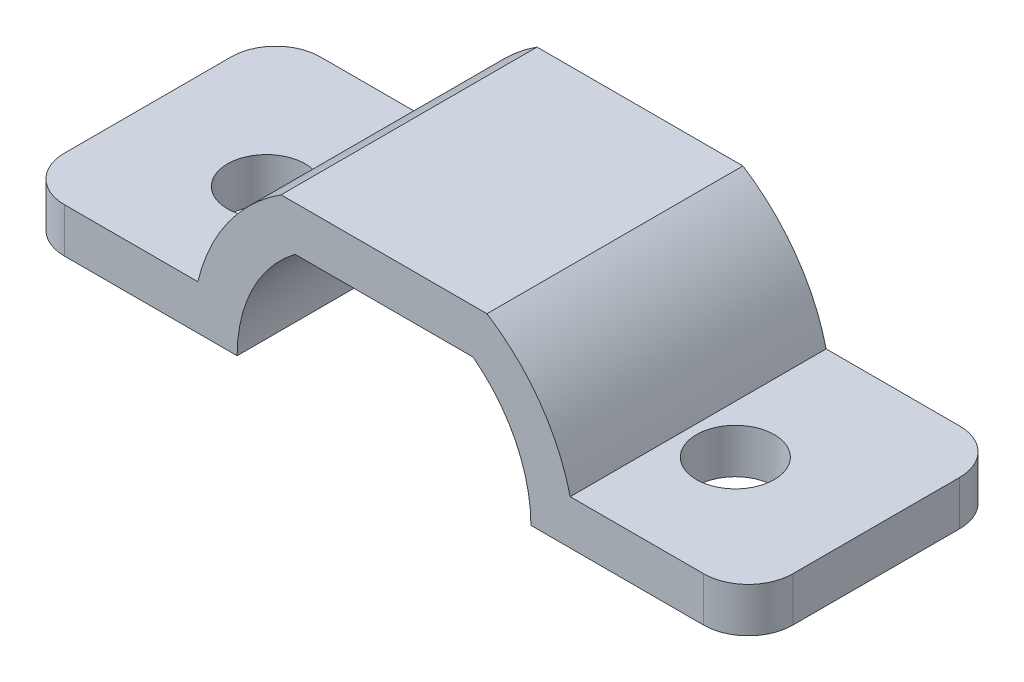
ISO-10303-21;
HEADER;
FILE_DESCRIPTION(('STEP AP214'),'2;1');
FILE_NAME('part.step','',(''),(''),'','','');
FILE_SCHEMA(('AUTOMOTIVE_DESIGN { 1 0 10303 214 1 1 1 1 }'));
ENDSEC;
DATA;
#1=APPLICATION_CONTEXT('core data for automotive mechanical design processes');
#2=APPLICATION_PROTOCOL_DEFINITION('international standard','automotive_design',2000,#1);
#3=PRODUCT_CONTEXT('',#1,'mechanical');
#4=PRODUCT('Part','Part','',(#3));
#5=PRODUCT_RELATED_PRODUCT_CATEGORY('part','',(#4));
#6=PRODUCT_DEFINITION_FORMATION('','',#4);
#7=PRODUCT_DEFINITION_CONTEXT('part definition',#1,'design');
#8=PRODUCT_DEFINITION('design','',#6,#7);
#9=PRODUCT_DEFINITION_SHAPE('','',#8);
#10=(LENGTH_UNIT() NAMED_UNIT(*) SI_UNIT(.MILLI.,.METRE.));
#11=(NAMED_UNIT(*) PLANE_ANGLE_UNIT() SI_UNIT($,.RADIAN.));
#12=(NAMED_UNIT(*) SI_UNIT($,.STERADIAN.) SOLID_ANGLE_UNIT());
#13=UNCERTAINTY_MEASURE_WITH_UNIT(LENGTH_MEASURE(1.E-05),#10,'distance_accuracy_value','');
#14=(GEOMETRIC_REPRESENTATION_CONTEXT(3) GLOBAL_UNCERTAINTY_ASSIGNED_CONTEXT((#13)) GLOBAL_UNIT_ASSIGNED_CONTEXT((#10,
#11,#12)) REPRESENTATION_CONTEXT('',''));
#15=CARTESIAN_POINT('',(0.,0.,0.));
#16=DIRECTION('',(0.,0.,1.));
#17=DIRECTION('',(1.,0.,0.));
#18=AXIS2_PLACEMENT_3D('',#15,#16,#17);
#19=CARTESIAN_POINT('',(0.,0.,5.75));
#20=DIRECTION('',(0.,0.,-1.));
#21=DIRECTION('',(-1.,0.,0.));
#22=AXIS2_PLACEMENT_3D('',#19,#20,#21);
#23=CYLINDRICAL_SURFACE('',#22,8.6);
#24=DIRECTION('',(0.,0.,-1.));
#25=VECTOR('',#24,1.);
#26=CARTESIAN_POINT('',(-8.36420946653059,2.,5.75));
#27=LINE('',#26,#25);
#28=CARTESIAN_POINT('',(-8.36420946653059,2.,5.75));
#29=VERTEX_POINT('',#28);
#30=CARTESIAN_POINT('',(-8.36420946653059,2.,-5.75));
#31=VERTEX_POINT('',#30);
#32=EDGE_CURVE('E152',#29,#31,#27,.T.);
#33=ORIENTED_EDGE('',*,*,#32,.F.);
#34=CARTESIAN_POINT('',(0.,0.,5.75));
#35=DIRECTION('',(0.,0.,1.));
#36=DIRECTION('',(1.,0.,0.));
#37=AXIS2_PLACEMENT_3D('',#34,#35,#36);
#38=CIRCLE('',#37,8.6);
#39=CARTESIAN_POINT('',(-4.62574318353278,7.25,5.75));
#40=VERTEX_POINT('',#39);
#41=EDGE_CURVE('E164',#40,#29,#38,.T.);
#42=ORIENTED_EDGE('',*,*,#41,.F.);
#43=DIRECTION('',(0.,0.,-1.));
#44=VECTOR('',#43,1.);
#45=CARTESIAN_POINT('',(-4.62574318353278,7.25,5.75));
#46=LINE('',#45,#44);
#47=CARTESIAN_POINT('',(-4.62574318353278,7.25,-5.75));
#48=VERTEX_POINT('',#47);
#49=EDGE_CURVE('E216',#40,#48,#46,.T.);
#50=ORIENTED_EDGE('',*,*,#49,.T.);
#51=CARTESIAN_POINT('',(0.,0.,-5.75));
#52=DIRECTION('',(0.,0.,1.));
#53=DIRECTION('',(1.,0.,0.));
#54=AXIS2_PLACEMENT_3D('',#51,#52,#53);
#55=CIRCLE('',#54,8.6);
#56=EDGE_CURVE('E167',#48,#31,#55,.T.);
#57=ORIENTED_EDGE('',*,*,#56,.T.);
#58=EDGE_LOOP('',(#33,#42,#50,#57));
#59=FACE_BOUND('',#58,.T.);
#60=ADVANCED_FACE('F35',(#59),#23,.T.);
#61=CARTESIAN_POINT('',(0.,0.,5.75));
#62=DIRECTION('',(0.,1.,0.));
#63=DIRECTION('',(0.,0.,1.));
#64=AXIS2_PLACEMENT_3D('',#61,#62,#63);
#65=PLANE('',#64);
#66=CARTESIAN_POINT('',(10.535,0.,0.5));
#67=DIRECTION('',(0.,-1.,0.));
#68=DIRECTION('',(0.,0.,1.));
#69=AXIS2_PLACEMENT_3D('',#66,#67,#68);
#70=CIRCLE('',#69,1.75);
#71=CARTESIAN_POINT('',(10.535,0.,2.25));
#72=VERTEX_POINT('',#71);
#73=EDGE_CURVE('E517',#72,#72,#70,.T.);
#74=ORIENTED_EDGE('',*,*,#73,.F.);
#75=EDGE_LOOP('',(#74));
#76=FACE_BOUND('',#75,.T.);
#77=DIRECTION('',(1.,0.,0.));
#78=VECTOR('',#77,1.);
#79=CARTESIAN_POINT('',(0.,0.,-5.75));
#80=LINE('',#79,#78);
#81=CARTESIAN_POINT('',(6.6,0.,-5.75));
#82=VERTEX_POINT('',#81);
#83=CARTESIAN_POINT('',(14.3642094665306,0.,-5.75));
#84=VERTEX_POINT('',#83);
#85=EDGE_CURVE('E221',#82,#84,#80,.T.);
#86=ORIENTED_EDGE('',*,*,#85,.T.);
#87=CARTESIAN_POINT('',(14.3642094665306,0.,-3.75));
#88=DIRECTION('',(0.,1.,0.));
#89=DIRECTION('',(0.,0.,1.));
#90=AXIS2_PLACEMENT_3D('',#87,#88,#89);
#91=CIRCLE('',#90,2.);
#92=CARTESIAN_POINT('',(16.3642094665306,0.,-3.75));
#93=VERTEX_POINT('',#92);
#94=EDGE_CURVE('E11',#84,#93,#91,.F.);
#95=ORIENTED_EDGE('',*,*,#94,.T.);
#96=DIRECTION('',(0.,0.,-1.));
#97=VECTOR('',#96,1.);
#98=CARTESIAN_POINT('',(16.3642094665306,0.,5.75));
#99=LINE('',#98,#97);
#100=CARTESIAN_POINT('',(16.3642094665306,0.,3.75));
#101=VERTEX_POINT('',#100);
#102=EDGE_CURVE('E238',#101,#93,#99,.T.);
#103=ORIENTED_EDGE('',*,*,#102,.F.);
#104=CARTESIAN_POINT('',(14.3642094665306,0.,3.75));
#105=DIRECTION('',(0.,1.,0.));
#106=DIRECTION('',(0.,0.,1.));
#107=AXIS2_PLACEMENT_3D('',#104,#105,#106);
#108=CIRCLE('',#107,2.);
#109=CARTESIAN_POINT('',(14.3642094665306,0.,5.75));
#110=VERTEX_POINT('',#109);
#111=EDGE_CURVE('E43',#101,#110,#108,.F.);
#112=ORIENTED_EDGE('',*,*,#111,.T.);
#113=DIRECTION('',(1.,0.,0.));
#114=VECTOR('',#113,1.);
#115=CARTESIAN_POINT('',(0.,0.,5.75));
#116=LINE('',#115,#114);
#117=CARTESIAN_POINT('',(6.6,0.,5.75));
#118=VERTEX_POINT('',#117);
#119=EDGE_CURVE('E222',#118,#110,#116,.T.);
#120=ORIENTED_EDGE('',*,*,#119,.F.);
#121=DIRECTION('',(0.,0.,-1.));
#122=VECTOR('',#121,1.);
#123=CARTESIAN_POINT('',(6.6,0.,5.75));
#124=LINE('',#123,#122);
#125=EDGE_CURVE('E190',#118,#82,#124,.T.);
#126=ORIENTED_EDGE('',*,*,#125,.T.);
#127=EDGE_LOOP('',(#86,#95,#103,#112,#120,#126));
#128=FACE_BOUND('',#127,.T.);
#129=ADVANCED_FACE('F270',(#76,#128),#65,.F.);
#130=CARTESIAN_POINT('',(16.3642094665306,0.,5.75));
#131=DIRECTION('',(-1.,0.,0.));
#132=DIRECTION('',(0.,0.,1.));
#133=AXIS2_PLACEMENT_3D('',#130,#131,#132);
#134=PLANE('',#133);
#135=ORIENTED_EDGE('',*,*,#102,.T.);
#136=DIRECTION('',(0.,1.,0.));
#137=VECTOR('',#136,1.);
#138=CARTESIAN_POINT('',(16.3642094665306,0.,-3.75));
#139=LINE('',#138,#137);
#140=CARTESIAN_POINT('',(16.3642094665306,2.,-3.75));
#141=VERTEX_POINT('',#140);
#142=EDGE_CURVE('E263',#93,#141,#139,.T.);
#143=ORIENTED_EDGE('',*,*,#142,.T.);
#144=DIRECTION('',(0.,0.,-1.));
#145=VECTOR('',#144,1.);
#146=CARTESIAN_POINT('',(16.3642094665306,2.,5.75));
#147=LINE('',#146,#145);
#148=CARTESIAN_POINT('',(16.3642094665306,2.,3.75));
#149=VERTEX_POINT('',#148);
#150=EDGE_CURVE('E235',#149,#141,#147,.T.);
#151=ORIENTED_EDGE('',*,*,#150,.F.);
#152=DIRECTION('',(0.,1.,0.));
#153=VECTOR('',#152,1.);
#154=CARTESIAN_POINT('',(16.3642094665306,0.,3.75));
#155=LINE('',#154,#153);
#156=EDGE_CURVE('E55',#149,#101,#155,.F.);
#157=ORIENTED_EDGE('',*,*,#156,.T.);
#158=EDGE_LOOP('',(#135,#143,#151,#157));
#159=FACE_BOUND('',#158,.T.);
#160=ADVANCED_FACE('F279',(#159),#134,.F.);
#161=CARTESIAN_POINT('',(0.,2.,5.75));
#162=DIRECTION('',(0.,1.,0.));
#163=DIRECTION('',(0.,0.,1.));
#164=AXIS2_PLACEMENT_3D('',#161,#162,#163);
#165=PLANE('',#164);
#166=CARTESIAN_POINT('',(10.535,2.,0.5));
#167=DIRECTION('',(0.,-1.,0.));
#168=DIRECTION('',(0.,0.,1.));
#169=AXIS2_PLACEMENT_3D('',#166,#167,#168);
#170=CIRCLE('',#169,1.75);
#171=CARTESIAN_POINT('',(10.535,2.,2.25));
#172=VERTEX_POINT('',#171);
#173=EDGE_CURVE('E519',#172,#172,#170,.T.);
#174=ORIENTED_EDGE('',*,*,#173,.T.);
#175=EDGE_LOOP('',(#174));
#176=FACE_BOUND('',#175,.T.);
#177=ORIENTED_EDGE('',*,*,#150,.T.);
#178=CARTESIAN_POINT('',(14.3642094665306,2.,-3.75));
#179=DIRECTION('',(0.,1.,0.));
#180=DIRECTION('',(0.,0.,1.));
#181=AXIS2_PLACEMENT_3D('',#178,#179,#180);
#182=CIRCLE('',#181,2.);
#183=CARTESIAN_POINT('',(14.3642094665306,2.,-5.75));
#184=VERTEX_POINT('',#183);
#185=EDGE_CURVE('E268',#141,#184,#182,.T.);
#186=ORIENTED_EDGE('',*,*,#185,.T.);
#187=DIRECTION('',(1.,0.,0.));
#188=VECTOR('',#187,1.);
#189=CARTESIAN_POINT('',(0.,2.,-5.75));
#190=LINE('',#189,#188);
#191=CARTESIAN_POINT('',(8.36420946653059,2.,-5.75));
#192=VERTEX_POINT('',#191);
#193=EDGE_CURVE('E226',#192,#184,#190,.T.);
#194=ORIENTED_EDGE('',*,*,#193,.F.);
#195=DIRECTION('',(0.,0.,-1.));
#196=VECTOR('',#195,1.);
#197=CARTESIAN_POINT('',(8.36420946653059,2.,5.75));
#198=LINE('',#197,#196);
#199=CARTESIAN_POINT('',(8.36420946653059,2.,5.75));
#200=VERTEX_POINT('',#199);
#201=EDGE_CURVE('E229',#200,#192,#198,.T.);
#202=ORIENTED_EDGE('',*,*,#201,.F.);
#203=DIRECTION('',(1.,0.,0.));
#204=VECTOR('',#203,1.);
#205=CARTESIAN_POINT('',(0.,2.,5.75));
#206=LINE('',#205,#204);
#207=CARTESIAN_POINT('',(14.3642094665306,2.,5.75));
#208=VERTEX_POINT('',#207);
#209=EDGE_CURVE('E225',#200,#208,#206,.T.);
#210=ORIENTED_EDGE('',*,*,#209,.T.);
#211=CARTESIAN_POINT('',(14.3642094665306,2.,3.75));
#212=DIRECTION('',(0.,1.,0.));
#213=DIRECTION('',(0.,0.,1.));
#214=AXIS2_PLACEMENT_3D('',#211,#212,#213);
#215=CIRCLE('',#214,2.);
#216=EDGE_CURVE('E266',#208,#149,#215,.T.);
#217=ORIENTED_EDGE('',*,*,#216,.T.);
#218=EDGE_LOOP('',(#177,#186,#194,#202,#210,#217));
#219=FACE_BOUND('',#218,.T.);
#220=ADVANCED_FACE('F277',(#176,#219),#165,.T.);
#221=CARTESIAN_POINT('',(0.,0.,5.75));
#222=DIRECTION('',(0.,0.,1.));
#223=DIRECTION('',(1.,0.,0.));
#224=AXIS2_PLACEMENT_3D('',#221,#222,#223);
#225=PLANE('',#224);
#226=DIRECTION('',(-1.,0.,0.));
#227=VECTOR('',#226,1.);
#228=CARTESIAN_POINT('',(0.,2.,5.75));
#229=LINE('',#228,#227);
#230=CARTESIAN_POINT('',(-14.3642094665306,2.,5.75));
#231=VERTEX_POINT('',#230);
#232=EDGE_CURVE('E147',#29,#231,#229,.T.);
#233=ORIENTED_EDGE('',*,*,#232,.T.);
#234=DIRECTION('',(0.,1.,0.));
#235=VECTOR('',#234,1.);
#236=CARTESIAN_POINT('',(-14.3642094665306,0.,5.75));
#237=LINE('',#236,#235);
#238=CARTESIAN_POINT('',(-14.3642094665306,0.,5.75));
#239=VERTEX_POINT('',#238);
#240=EDGE_CURVE('E251',#231,#239,#237,.F.);
#241=ORIENTED_EDGE('',*,*,#240,.T.);
#242=DIRECTION('',(-1.,0.,0.));
#243=VECTOR('',#242,1.);
#244=CARTESIAN_POINT('',(0.,0.,5.75));
#245=LINE('',#244,#243);
#246=CARTESIAN_POINT('',(-6.6,0.,5.75));
#247=VERTEX_POINT('',#246);
#248=EDGE_CURVE('E174',#247,#239,#245,.T.);
#249=ORIENTED_EDGE('',*,*,#248,.F.);
#250=CARTESIAN_POINT('',(0.,0.,5.75));
#251=DIRECTION('',(0.,0.,1.));
#252=DIRECTION('',(1.,0.,0.));
#253=AXIS2_PLACEMENT_3D('',#250,#251,#252);
#254=CIRCLE('',#253,6.6);
#255=CARTESIAN_POINT('',(-3.99968748779202,5.25,5.75));
#256=VERTEX_POINT('',#255);
#257=EDGE_CURVE('E177',#256,#247,#254,.T.);
#258=ORIENTED_EDGE('',*,*,#257,.F.);
#259=DIRECTION('',(1.,0.,0.));
#260=VECTOR('',#259,1.);
#261=CARTESIAN_POINT('',(0.,5.25,5.75));
#262=LINE('',#261,#260);
#263=CARTESIAN_POINT('',(3.99968748779202,5.25,5.75));
#264=VERTEX_POINT('',#263);
#265=EDGE_CURVE('E185',#256,#264,#262,.T.);
#266=ORIENTED_EDGE('',*,*,#265,.T.);
#267=CARTESIAN_POINT('',(0.,0.,5.75));
#268=DIRECTION('',(0.,0.,1.));
#269=DIRECTION('',(1.,0.,0.));
#270=AXIS2_PLACEMENT_3D('',#267,#268,#269);
#271=CIRCLE('',#270,6.6);
#272=EDGE_CURVE('E187',#118,#264,#271,.T.);
#273=ORIENTED_EDGE('',*,*,#272,.F.);
#274=ORIENTED_EDGE('',*,*,#119,.T.);
#275=DIRECTION('',(0.,1.,0.));
#276=VECTOR('',#275,1.);
#277=CARTESIAN_POINT('',(14.3642094665306,2.,5.75));
#278=LINE('',#277,#276);
#279=EDGE_CURVE('E248',#110,#208,#278,.T.);
#280=ORIENTED_EDGE('',*,*,#279,.T.);
#281=ORIENTED_EDGE('',*,*,#209,.F.);
#282=CARTESIAN_POINT('',(0.,0.,5.75));
#283=DIRECTION('',(0.,0.,1.));
#284=DIRECTION('',(1.,0.,0.));
#285=AXIS2_PLACEMENT_3D('',#282,#283,#284);
#286=CIRCLE('',#285,8.6);
#287=CARTESIAN_POINT('',(4.62574318353278,7.25,5.75));
#288=VERTEX_POINT('',#287);
#289=EDGE_CURVE('E179',#200,#288,#286,.T.);
#290=ORIENTED_EDGE('',*,*,#289,.T.);
#291=DIRECTION('',(1.,0.,0.));
#292=VECTOR('',#291,1.);
#293=CARTESIAN_POINT('',(0.,7.25,5.75));
#294=LINE('',#293,#292);
#295=EDGE_CURVE('E173',#40,#288,#294,.T.);
#296=ORIENTED_EDGE('',*,*,#295,.F.);
#297=ORIENTED_EDGE('',*,*,#41,.T.);
#298=EDGE_LOOP('',(#233,#241,#249,#258,#266,#273,#274,#280,#281,#290,#296,#297));
#299=FACE_BOUND('',#298,.T.);
#300=ADVANCED_FACE('F171',(#299),#225,.T.);
#301=CARTESIAN_POINT('',(0.,0.,-5.75));
#302=DIRECTION('',(0.,0.,1.));
#303=DIRECTION('',(1.,0.,0.));
#304=AXIS2_PLACEMENT_3D('',#301,#302,#303);
#305=PLANE('',#304);
#306=DIRECTION('',(-1.,0.,0.));
#307=VECTOR('',#306,1.);
#308=CARTESIAN_POINT('',(0.,0.,-5.75));
#309=LINE('',#308,#307);
#310=CARTESIAN_POINT('',(-6.6,0.,-5.75));
#311=VERTEX_POINT('',#310);
#312=CARTESIAN_POINT('',(-14.3642094665306,0.,-5.75));
#313=VERTEX_POINT('',#312);
#314=EDGE_CURVE('E196',#311,#313,#309,.T.);
#315=ORIENTED_EDGE('',*,*,#314,.T.);
#316=DIRECTION('',(0.,1.,0.));
#317=VECTOR('',#316,1.);
#318=CARTESIAN_POINT('',(-14.3642094665306,2.,-5.75));
#319=LINE('',#318,#317);
#320=CARTESIAN_POINT('',(-14.3642094665306,2.,-5.75));
#321=VERTEX_POINT('',#320);
#322=EDGE_CURVE('E259',#313,#321,#319,.T.);
#323=ORIENTED_EDGE('',*,*,#322,.T.);
#324=DIRECTION('',(-1.,0.,0.));
#325=VECTOR('',#324,1.);
#326=CARTESIAN_POINT('',(0.,2.,-5.75));
#327=LINE('',#326,#325);
#328=EDGE_CURVE('E159',#31,#321,#327,.T.);
#329=ORIENTED_EDGE('',*,*,#328,.F.);
#330=ORIENTED_EDGE('',*,*,#56,.F.);
#331=DIRECTION('',(1.,0.,0.));
#332=VECTOR('',#331,1.);
#333=CARTESIAN_POINT('',(0.,7.25,-5.75));
#334=LINE('',#333,#332);
#335=CARTESIAN_POINT('',(4.62574318353278,7.25,-5.75));
#336=VERTEX_POINT('',#335);
#337=EDGE_CURVE('E192',#48,#336,#334,.T.);
#338=ORIENTED_EDGE('',*,*,#337,.T.);
#339=CARTESIAN_POINT('',(0.,0.,-5.75));
#340=DIRECTION('',(0.,0.,1.));
#341=DIRECTION('',(1.,0.,0.));
#342=AXIS2_PLACEMENT_3D('',#339,#340,#341);
#343=CIRCLE('',#342,8.6);
#344=EDGE_CURVE('E168',#192,#336,#343,.T.);
#345=ORIENTED_EDGE('',*,*,#344,.F.);
#346=ORIENTED_EDGE('',*,*,#193,.T.);
#347=DIRECTION('',(0.,1.,0.));
#348=VECTOR('',#347,1.);
#349=CARTESIAN_POINT('',(14.3642094665306,0.,-5.75));
#350=LINE('',#349,#348);
#351=EDGE_CURVE('E257',#184,#84,#350,.F.);
#352=ORIENTED_EDGE('',*,*,#351,.T.);
#353=ORIENTED_EDGE('',*,*,#85,.F.);
#354=CARTESIAN_POINT('',(0.,0.,-5.75));
#355=DIRECTION('',(0.,0.,1.));
#356=DIRECTION('',(1.,0.,0.));
#357=AXIS2_PLACEMENT_3D('',#354,#355,#356);
#358=CIRCLE('',#357,6.6);
#359=CARTESIAN_POINT('',(3.99968748779202,5.25,-5.75));
#360=VERTEX_POINT('',#359);
#361=EDGE_CURVE('E205',#82,#360,#358,.T.);
#362=ORIENTED_EDGE('',*,*,#361,.T.);
#363=DIRECTION('',(1.,0.,0.));
#364=VECTOR('',#363,1.);
#365=CARTESIAN_POINT('',(0.,5.25,-5.75));
#366=LINE('',#365,#364);
#367=CARTESIAN_POINT('',(-3.99968748779202,5.25,-5.75));
#368=VERTEX_POINT('',#367);
#369=EDGE_CURVE('E202',#368,#360,#366,.T.);
#370=ORIENTED_EDGE('',*,*,#369,.F.);
#371=CARTESIAN_POINT('',(0.,0.,-5.75));
#372=DIRECTION('',(0.,0.,1.));
#373=DIRECTION('',(1.,0.,0.));
#374=AXIS2_PLACEMENT_3D('',#371,#372,#373);
#375=CIRCLE('',#374,6.6);
#376=EDGE_CURVE('E199',#368,#311,#375,.T.);
#377=ORIENTED_EDGE('',*,*,#376,.T.);
#378=EDGE_LOOP('',(#315,#323,#329,#330,#338,#345,#346,#352,#353,#362,#370,#377));
#379=FACE_BOUND('',#378,.T.);
#380=ADVANCED_FACE('F286',(#379),#305,.F.);
#381=CARTESIAN_POINT('',(0.,0.,5.75));
#382=DIRECTION('',(0.,0.,-1.));
#383=DIRECTION('',(-1.,0.,0.));
#384=AXIS2_PLACEMENT_3D('',#381,#382,#383);
#385=CYLINDRICAL_SURFACE('',#384,8.6);
#386=ORIENTED_EDGE('',*,*,#201,.T.);
#387=ORIENTED_EDGE('',*,*,#344,.T.);
#388=DIRECTION('',(0.,0.,-1.));
#389=VECTOR('',#388,1.);
#390=CARTESIAN_POINT('',(4.62574318353278,7.25,5.75));
#391=LINE('',#390,#389);
#392=EDGE_CURVE('E218',#288,#336,#391,.T.);
#393=ORIENTED_EDGE('',*,*,#392,.F.);
#394=ORIENTED_EDGE('',*,*,#289,.F.);
#395=EDGE_LOOP('',(#386,#387,#393,#394));
#396=FACE_BOUND('',#395,.T.);
#397=ADVANCED_FACE('F290',(#396),#385,.T.);
#398=CARTESIAN_POINT('',(0.,7.25,5.75));
#399=DIRECTION('',(0.,1.,0.));
#400=DIRECTION('',(0.,0.,1.));
#401=AXIS2_PLACEMENT_3D('',#398,#399,#400);
#402=PLANE('',#401);
#403=ORIENTED_EDGE('',*,*,#337,.F.);
#404=ORIENTED_EDGE('',*,*,#49,.F.);
#405=ORIENTED_EDGE('',*,*,#295,.T.);
#406=ORIENTED_EDGE('',*,*,#392,.T.);
#407=EDGE_LOOP('',(#403,#404,#405,#406));
#408=FACE_BOUND('',#407,.T.);
#409=ADVANCED_FACE('F292',(#408),#402,.T.);
#410=CARTESIAN_POINT('',(0.,0.,5.75));
#411=DIRECTION('',(0.,-1.,0.));
#412=DIRECTION('',(1.,0.,0.));
#413=AXIS2_PLACEMENT_3D('',#410,#411,#412);
#414=PLANE('',#413);
#415=CARTESIAN_POINT('',(-10.535,0.,0.5));
#416=DIRECTION('',(0.,1.,0.));
#417=DIRECTION('',(0.,0.,1.));
#418=AXIS2_PLACEMENT_3D('',#415,#416,#417);
#419=CIRCLE('',#418,1.75);
#420=CARTESIAN_POINT('',(-10.535,0.,2.25));
#421=VERTEX_POINT('',#420);
#422=EDGE_CURVE('E294',#421,#421,#419,.T.);
#423=ORIENTED_EDGE('',*,*,#422,.T.);
#424=EDGE_LOOP('',(#423));
#425=FACE_BOUND('',#424,.T.);
#426=ORIENTED_EDGE('',*,*,#248,.T.);
#427=CARTESIAN_POINT('',(-14.3642094665306,0.,3.75));
#428=DIRECTION('',(0.,-1.,0.));
#429=DIRECTION('',(1.,0.,0.));
#430=AXIS2_PLACEMENT_3D('',#427,#428,#429);
#431=CIRCLE('',#430,2.);
#432=CARTESIAN_POINT('',(-16.3642094665306,0.,3.75));
#433=VERTEX_POINT('',#432);
#434=EDGE_CURVE('E255',#239,#433,#431,.T.);
#435=ORIENTED_EDGE('',*,*,#434,.T.);
#436=DIRECTION('',(0.,0.,-1.));
#437=VECTOR('',#436,1.);
#438=CARTESIAN_POINT('',(-16.3642094665306,0.,5.75));
#439=LINE('',#438,#437);
#440=CARTESIAN_POINT('',(-16.3642094665306,0.,-3.75));
#441=VERTEX_POINT('',#440);
#442=EDGE_CURVE('E158',#433,#441,#439,.T.);
#443=ORIENTED_EDGE('',*,*,#442,.T.);
#444=CARTESIAN_POINT('',(-14.3642094665306,0.,-3.75));
#445=DIRECTION('',(0.,-1.,0.));
#446=DIRECTION('',(1.,0.,0.));
#447=AXIS2_PLACEMENT_3D('',#444,#445,#446);
#448=CIRCLE('',#447,2.);
#449=EDGE_CURVE('E253',#441,#313,#448,.T.);
#450=ORIENTED_EDGE('',*,*,#449,.T.);
#451=ORIENTED_EDGE('',*,*,#314,.F.);
#452=DIRECTION('',(0.,0.,-1.));
#453=VECTOR('',#452,1.);
#454=CARTESIAN_POINT('',(-6.6,0.,5.75));
#455=LINE('',#454,#453);
#456=EDGE_CURVE('E214',#247,#311,#455,.T.);
#457=ORIENTED_EDGE('',*,*,#456,.F.);
#458=EDGE_LOOP('',(#426,#435,#443,#450,#451,#457));
#459=FACE_BOUND('',#458,.T.);
#460=ADVANCED_FACE('F314',(#425,#459),#414,.T.);
#461=CARTESIAN_POINT('',(0.,0.,5.75));
#462=DIRECTION('',(0.,0.,-1.));
#463=DIRECTION('',(-1.,0.,0.));
#464=AXIS2_PLACEMENT_3D('',#461,#462,#463);
#465=CYLINDRICAL_SURFACE('',#464,6.6);
#466=ORIENTED_EDGE('',*,*,#376,.F.);
#467=DIRECTION('',(0.,0.,-1.));
#468=VECTOR('',#467,1.);
#469=CARTESIAN_POINT('',(-3.99968748779202,5.25,5.75));
#470=LINE('',#469,#468);
#471=EDGE_CURVE('E212',#256,#368,#470,.T.);
#472=ORIENTED_EDGE('',*,*,#471,.F.);
#473=ORIENTED_EDGE('',*,*,#257,.T.);
#474=ORIENTED_EDGE('',*,*,#456,.T.);
#475=EDGE_LOOP('',(#466,#472,#473,#474));
#476=FACE_BOUND('',#475,.T.);
#477=ADVANCED_FACE('F318',(#476),#465,.F.);
#478=CARTESIAN_POINT('',(0.,5.25,5.75));
#479=DIRECTION('',(0.,1.,0.));
#480=DIRECTION('',(0.,0.,1.));
#481=AXIS2_PLACEMENT_3D('',#478,#479,#480);
#482=PLANE('',#481);
#483=ORIENTED_EDGE('',*,*,#369,.T.);
#484=DIRECTION('',(0.,0.,-1.));
#485=VECTOR('',#484,1.);
#486=CARTESIAN_POINT('',(3.99968748779202,5.25,5.75));
#487=LINE('',#486,#485);
#488=EDGE_CURVE('E210',#264,#360,#487,.T.);
#489=ORIENTED_EDGE('',*,*,#488,.F.);
#490=ORIENTED_EDGE('',*,*,#265,.F.);
#491=ORIENTED_EDGE('',*,*,#471,.T.);
#492=EDGE_LOOP('',(#483,#489,#490,#491));
#493=FACE_BOUND('',#492,.T.);
#494=ADVANCED_FACE('F395',(#493),#482,.F.);
#495=CARTESIAN_POINT('',(0.,0.,5.75));
#496=DIRECTION('',(0.,0.,-1.));
#497=DIRECTION('',(-1.,0.,0.));
#498=AXIS2_PLACEMENT_3D('',#495,#496,#497);
#499=CYLINDRICAL_SURFACE('',#498,6.6);
#500=ORIENTED_EDGE('',*,*,#361,.F.);
#501=ORIENTED_EDGE('',*,*,#125,.F.);
#502=ORIENTED_EDGE('',*,*,#272,.T.);
#503=ORIENTED_EDGE('',*,*,#488,.T.);
#504=EDGE_LOOP('',(#500,#501,#502,#503));
#505=FACE_BOUND('',#504,.T.);
#506=ADVANCED_FACE('F401',(#505),#499,.F.);
#507=CARTESIAN_POINT('',(0.,2.,5.75));
#508=DIRECTION('',(0.,-1.,0.));
#509=DIRECTION('',(0.,0.,-1.));
#510=AXIS2_PLACEMENT_3D('',#507,#508,#509);
#511=PLANE('',#510);
#512=CARTESIAN_POINT('',(-10.535,2.,0.5));
#513=DIRECTION('',(0.,1.,0.));
#514=DIRECTION('',(0.,0.,1.));
#515=AXIS2_PLACEMENT_3D('',#512,#513,#514);
#516=CIRCLE('',#515,1.75);
#517=CARTESIAN_POINT('',(-10.535,2.,2.25));
#518=VERTEX_POINT('',#517);
#519=EDGE_CURVE('E297',#518,#518,#516,.T.);
#520=ORIENTED_EDGE('',*,*,#519,.F.);
#521=EDGE_LOOP('',(#520));
#522=FACE_BOUND('',#521,.T.);
#523=DIRECTION('',(0.,0.,-1.));
#524=VECTOR('',#523,1.);
#525=CARTESIAN_POINT('',(-16.3642094665306,2.,5.75));
#526=LINE('',#525,#524);
#527=CARTESIAN_POINT('',(-16.3642094665306,2.,3.75));
#528=VERTEX_POINT('',#527);
#529=CARTESIAN_POINT('',(-16.3642094665306,2.,-3.75));
#530=VERTEX_POINT('',#529);
#531=EDGE_CURVE('E169',#528,#530,#526,.T.);
#532=ORIENTED_EDGE('',*,*,#531,.F.);
#533=CARTESIAN_POINT('',(-14.3642094665306,2.,3.75));
#534=DIRECTION('',(0.,-1.,0.));
#535=DIRECTION('',(0.,0.,-1.));
#536=AXIS2_PLACEMENT_3D('',#533,#534,#535);
#537=CIRCLE('',#536,2.);
#538=EDGE_CURVE('E154',#528,#231,#537,.F.);
#539=ORIENTED_EDGE('',*,*,#538,.T.);
#540=ORIENTED_EDGE('',*,*,#232,.F.);
#541=ORIENTED_EDGE('',*,*,#32,.T.);
#542=ORIENTED_EDGE('',*,*,#328,.T.);
#543=CARTESIAN_POINT('',(-14.3642094665306,2.,-3.75));
#544=DIRECTION('',(0.,-1.,0.));
#545=DIRECTION('',(0.,0.,-1.));
#546=AXIS2_PLACEMENT_3D('',#543,#544,#545);
#547=CIRCLE('',#546,2.);
#548=EDGE_CURVE('E245',#321,#530,#547,.F.);
#549=ORIENTED_EDGE('',*,*,#548,.T.);
#550=EDGE_LOOP('',(#532,#539,#540,#541,#542,#549));
#551=FACE_BOUND('',#550,.T.);
#552=ADVANCED_FACE('F150',(#522,#551),#511,.F.);
#553=CARTESIAN_POINT('',(-16.3642094665306,0.,5.75));
#554=DIRECTION('',(-1.,0.,0.));
#555=DIRECTION('',(0.,0.,1.));
#556=AXIS2_PLACEMENT_3D('',#553,#554,#555);
#557=PLANE('',#556);
#558=ORIENTED_EDGE('',*,*,#442,.F.);
#559=DIRECTION('',(0.,1.,0.));
#560=VECTOR('',#559,1.);
#561=CARTESIAN_POINT('',(-16.3642094665306,0.,3.75));
#562=LINE('',#561,#560);
#563=EDGE_CURVE('E242',#433,#528,#562,.T.);
#564=ORIENTED_EDGE('',*,*,#563,.T.);
#565=ORIENTED_EDGE('',*,*,#531,.T.);
#566=DIRECTION('',(0.,1.,0.));
#567=VECTOR('',#566,1.);
#568=CARTESIAN_POINT('',(-16.3642094665306,0.,-3.75));
#569=LINE('',#568,#567);
#570=EDGE_CURVE('E240',#530,#441,#569,.F.);
#571=ORIENTED_EDGE('',*,*,#570,.T.);
#572=EDGE_LOOP('',(#558,#564,#565,#571));
#573=FACE_BOUND('',#572,.T.);
#574=ADVANCED_FACE('F307',(#573),#557,.T.);
#575=CARTESIAN_POINT('',(-10.535,0.,0.5));
#576=DIRECTION('',(0.,1.,0.));
#577=DIRECTION('',(0.,0.,1.));
#578=AXIS2_PLACEMENT_3D('',#575,#576,#577);
#579=CYLINDRICAL_SURFACE('',#578,1.75);
#580=ORIENTED_EDGE('',*,*,#422,.F.);
#581=EDGE_LOOP('',(#580));
#582=FACE_BOUND('',#581,.T.);
#583=ORIENTED_EDGE('',*,*,#519,.T.);
#584=EDGE_LOOP('',(#583));
#585=FACE_BOUND('',#584,.T.);
#586=ADVANCED_FACE('F333',(#582,#585),#579,.F.);
#587=CARTESIAN_POINT('',(10.535,0.,0.5));
#588=DIRECTION('',(0.,1.,0.));
#589=DIRECTION('',(0.,0.,1.));
#590=AXIS2_PLACEMENT_3D('',#587,#588,#589);
#591=CYLINDRICAL_SURFACE('',#590,1.75);
#592=ORIENTED_EDGE('',*,*,#73,.T.);
#593=EDGE_LOOP('',(#592));
#594=FACE_BOUND('',#593,.T.);
#595=ORIENTED_EDGE('',*,*,#173,.F.);
#596=EDGE_LOOP('',(#595));
#597=FACE_BOUND('',#596,.T.);
#598=ADVANCED_FACE('F326',(#594,#597),#591,.F.);
#599=CARTESIAN_POINT('',(-14.3642094665306,0.,3.75));
#600=DIRECTION('',(0.,1.,0.));
#601=DIRECTION('',(0.,0.,1.));
#602=AXIS2_PLACEMENT_3D('',#599,#600,#601);
#603=CYLINDRICAL_SURFACE('',#602,2.);
#604=ORIENTED_EDGE('',*,*,#434,.F.);
#605=ORIENTED_EDGE('',*,*,#240,.F.);
#606=ORIENTED_EDGE('',*,*,#538,.F.);
#607=ORIENTED_EDGE('',*,*,#563,.F.);
#608=EDGE_LOOP('',(#604,#605,#606,#607));
#609=FACE_BOUND('',#608,.T.);
#610=ADVANCED_FACE('F324',(#609),#603,.T.);
#611=CARTESIAN_POINT('',(-14.3642094665306,0.,-3.75));
#612=DIRECTION('',(0.,-1.,0.));
#613=DIRECTION('',(0.,0.,-1.));
#614=AXIS2_PLACEMENT_3D('',#611,#612,#613);
#615=CYLINDRICAL_SURFACE('',#614,2.);
#616=ORIENTED_EDGE('',*,*,#449,.F.);
#617=ORIENTED_EDGE('',*,*,#570,.F.);
#618=ORIENTED_EDGE('',*,*,#548,.F.);
#619=ORIENTED_EDGE('',*,*,#322,.F.);
#620=EDGE_LOOP('',(#616,#617,#618,#619));
#621=FACE_BOUND('',#620,.T.);
#622=ADVANCED_FACE('F311',(#621),#615,.T.);
#623=CARTESIAN_POINT('',(14.3642094665306,0.,-3.75));
#624=DIRECTION('',(0.,1.,0.));
#625=DIRECTION('',(0.,0.,1.));
#626=AXIS2_PLACEMENT_3D('',#623,#624,#625);
#627=CYLINDRICAL_SURFACE('',#626,2.);
#628=ORIENTED_EDGE('',*,*,#94,.F.);
#629=ORIENTED_EDGE('',*,*,#351,.F.);
#630=ORIENTED_EDGE('',*,*,#185,.F.);
#631=ORIENTED_EDGE('',*,*,#142,.F.);
#632=EDGE_LOOP('',(#628,#629,#630,#631));
#633=FACE_BOUND('',#632,.T.);
#634=ADVANCED_FACE('F282',(#633),#627,.T.);
#635=CARTESIAN_POINT('',(14.3642094665306,0.,3.75));
#636=DIRECTION('',(0.,-1.,0.));
#637=DIRECTION('',(0.,0.,-1.));
#638=AXIS2_PLACEMENT_3D('',#635,#636,#637);
#639=CYLINDRICAL_SURFACE('',#638,2.);
#640=ORIENTED_EDGE('',*,*,#111,.F.);
#641=ORIENTED_EDGE('',*,*,#156,.F.);
#642=ORIENTED_EDGE('',*,*,#216,.F.);
#643=ORIENTED_EDGE('',*,*,#279,.F.);
#644=EDGE_LOOP('',(#640,#641,#642,#643));
#645=FACE_BOUND('',#644,.T.);
#646=ADVANCED_FACE('F37',(#645),#639,.T.);
#647=CLOSED_SHELL('',(#60,#129,#160,#220,#300,#380,#397,#409,#460,#477,#494,#506,#552,#574,#586,
#598,#610,#622,#634,#646));
#648=MANIFOLD_SOLID_BREP('B2',#647);
#649=ADVANCED_BREP_SHAPE_REPRESENTATION('',(#18,#648),#14);
#650=SHAPE_DEFINITION_REPRESENTATION(#9,#649);
ENDSEC;
END-ISO-10303-21;
